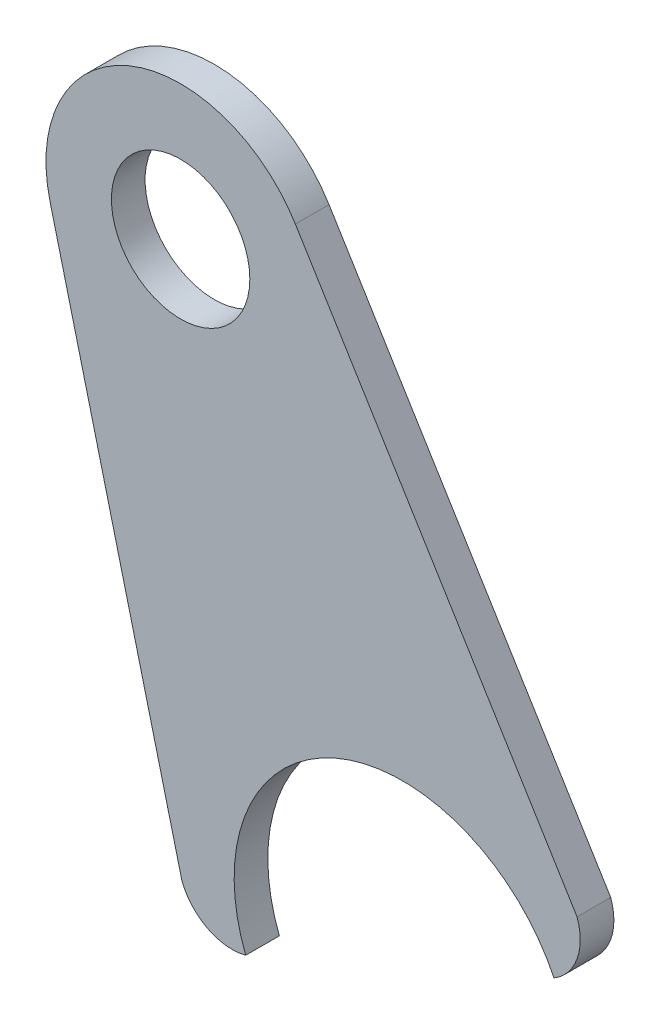
ISO-10303-21;
HEADER;
FILE_DESCRIPTION(('STEP AP214'),'2;1');
FILE_NAME('part.step','',(''),(''),'','','');
FILE_SCHEMA(('AUTOMOTIVE_DESIGN { 1 0 10303 214 1 1 1 1 }'));
ENDSEC;
DATA;
#1=APPLICATION_CONTEXT('core data for automotive mechanical design processes');
#2=APPLICATION_PROTOCOL_DEFINITION('international standard','automotive_design',2000,#1);
#3=PRODUCT_CONTEXT('',#1,'mechanical');
#4=PRODUCT('Part','Part','',(#3));
#5=PRODUCT_RELATED_PRODUCT_CATEGORY('part','',(#4));
#6=PRODUCT_DEFINITION_FORMATION('','',#4);
#7=PRODUCT_DEFINITION_CONTEXT('part definition',#1,'design');
#8=PRODUCT_DEFINITION('design','',#6,#7);
#9=PRODUCT_DEFINITION_SHAPE('','',#8);
#10=(LENGTH_UNIT() NAMED_UNIT(*) SI_UNIT(.MILLI.,.METRE.));
#11=(NAMED_UNIT(*) PLANE_ANGLE_UNIT() SI_UNIT($,.RADIAN.));
#12=(NAMED_UNIT(*) SI_UNIT($,.STERADIAN.) SOLID_ANGLE_UNIT());
#13=UNCERTAINTY_MEASURE_WITH_UNIT(LENGTH_MEASURE(1.E-05),#10,'distance_accuracy_value','');
#14=(GEOMETRIC_REPRESENTATION_CONTEXT(3) GLOBAL_UNCERTAINTY_ASSIGNED_CONTEXT((#13)) GLOBAL_UNIT_ASSIGNED_CONTEXT((#10,
#11,#12)) REPRESENTATION_CONTEXT('',''));
#15=CARTESIAN_POINT('',(0.,0.,0.));
#16=DIRECTION('',(0.,0.,1.));
#17=DIRECTION('',(1.,0.,0.));
#18=AXIS2_PLACEMENT_3D('',#15,#16,#17);
#19=CARTESIAN_POINT('',(-8.03353331694817,-0.430582274047139,1.5875));
#20=DIRECTION('',(0.,0.,-1.));
#21=DIRECTION('',(-1.,0.,0.));
#22=AXIS2_PLACEMENT_3D('',#19,#20,#21);
#23=PLANE('',#22);
#24=CARTESIAN_POINT('',(-8.03353331694817,-0.430582274047139,1.5875));
#25=DIRECTION('',(0.,0.,1.));
#26=DIRECTION('',(-1.,0.,0.));
#27=AXIS2_PLACEMENT_3D('',#24,#25,#26);
#28=CIRCLE('',#27,2.54);
#29=CARTESIAN_POINT('',(-10.3992230568477,-1.35530496465981,1.5875));
#30=VERTEX_POINT('',#29);
#31=CARTESIAN_POINT('',(-7.39325012638225,-2.88855652856624,1.5875));
#32=VERTEX_POINT('',#31);
#33=EDGE_CURVE('E143',#30,#32,#28,.T.);
#34=ORIENTED_EDGE('',*,*,#33,.T.);
#35=CARTESIAN_POINT('',(0.,0.,1.5875));
#36=DIRECTION('',(0.,0.,-1.));
#37=DIRECTION('',(1.,0.,0.));
#38=AXIS2_PLACEMENT_3D('',#35,#36,#37);
#39=CIRCLE('',#38,7.93749999999835);
#40=CARTESIAN_POINT('',(7.14682100900328,3.45352800991148,1.5875));
#41=VERTEX_POINT('',#40);
#42=EDGE_CURVE('E101',#32,#41,#39,.T.);
#43=ORIENTED_EDGE('',*,*,#42,.T.);
#44=CARTESIAN_POINT('',(5.84365736743861,5.6337492196294,1.5875));
#45=DIRECTION('',(0.,0.,1.));
#46=DIRECTION('',(1.,0.,0.));
#47=AXIS2_PLACEMENT_3D('',#44,#45,#46);
#48=CIRCLE('',#47,2.54);
#49=CARTESIAN_POINT('',(8.23265822447538,6.49646290624713,1.5875));
#50=VERTEX_POINT('',#49);
#51=EDGE_CURVE('E114',#41,#50,#48,.T.);
#52=ORIENTED_EDGE('',*,*,#51,.T.);
#53=DIRECTION('',(-0.522923544969686,0.852379590391709,0.));
#54=VECTOR('',#53,1.);
#55=CARTESIAN_POINT('',(8.23265822447538,6.49646290624713,1.5875));
#56=LINE('',#55,#54);
#57=CARTESIAN_POINT('',(-5.04959981775463,28.1469045021965,1.5875));
#58=VERTEX_POINT('',#57);
#59=EDGE_CURVE('E108',#50,#58,#56,.T.);
#60=ORIENTED_EDGE('',*,*,#59,.T.);
#61=CARTESIAN_POINT('',(-10.462210216742,24.826339991639,1.5875));
#62=DIRECTION('',(0.,0.,1.));
#63=DIRECTION('',(-1.,0.,0.));
#64=AXIS2_PLACEMENT_3D('',#61,#62,#63);
#65=CIRCLE('',#64,6.35);
#66=CARTESIAN_POINT('',(-16.6188921382303,23.2714227212934,1.5875));
#67=VERTEX_POINT('',#66);
#68=EDGE_CURVE('E112',#58,#67,#65,.T.);
#69=ORIENTED_EDGE('',*,*,#68,.T.);
#70=DIRECTION('',(0.244868861471754,-0.969556208108394,0.));
#71=VECTOR('',#70,1.);
#72=CARTESIAN_POINT('',(-10.3992230568477,-1.35530496465981,1.5875));
#73=LINE('',#72,#71);
#74=EDGE_CURVE('E64',#67,#30,#73,.T.);
#75=ORIENTED_EDGE('',*,*,#74,.T.);
#76=EDGE_LOOP('',(#34,#43,#52,#60,#69,#75));
#77=FACE_BOUND('',#76,.T.);
#78=CARTESIAN_POINT('',(-10.462210216742,24.826339991639,1.5875));
#79=DIRECTION('',(0.,0.,1.));
#80=DIRECTION('',(1.,0.,0.));
#81=AXIS2_PLACEMENT_3D('',#78,#79,#80);
#82=CIRCLE('',#81,3.26389999999782);
#83=CARTESIAN_POINT('',(-7.19831021674417,24.826339991639,1.5875));
#84=VERTEX_POINT('',#83);
#85=EDGE_CURVE('E136',#84,#84,#82,.T.);
#86=ORIENTED_EDGE('',*,*,#85,.F.);
#87=EDGE_LOOP('',(#86));
#88=FACE_BOUND('',#87,.T.);
#89=ADVANCED_FACE('F47',(#77,#88),#23,.F.);
#90=CARTESIAN_POINT('',(-8.03353331694817,-0.430582274047139,0.));
#91=DIRECTION('',(0.,0.,-1.));
#92=DIRECTION('',(-1.,0.,0.));
#93=AXIS2_PLACEMENT_3D('',#90,#91,#92);
#94=PLANE('',#93);
#95=CARTESIAN_POINT('',(-8.03353331694817,-0.430582274047139,0.));
#96=DIRECTION('',(0.,0.,1.));
#97=DIRECTION('',(-1.,0.,0.));
#98=AXIS2_PLACEMENT_3D('',#95,#96,#97);
#99=CIRCLE('',#98,2.54);
#100=CARTESIAN_POINT('',(-10.3992230568477,-1.35530496465981,0.));
#101=VERTEX_POINT('',#100);
#102=CARTESIAN_POINT('',(-7.39325012638225,-2.88855652856624,0.));
#103=VERTEX_POINT('',#102);
#104=EDGE_CURVE('E132',#101,#103,#99,.T.);
#105=ORIENTED_EDGE('',*,*,#104,.F.);
#106=DIRECTION('',(0.244868861471754,-0.969556208108394,0.));
#107=VECTOR('',#106,1.);
#108=CARTESIAN_POINT('',(-10.3992230568477,-1.35530496465981,0.));
#109=LINE('',#108,#107);
#110=CARTESIAN_POINT('',(-16.6188921382303,23.2714227212934,0.));
#111=VERTEX_POINT('',#110);
#112=EDGE_CURVE('E93',#111,#101,#109,.T.);
#113=ORIENTED_EDGE('',*,*,#112,.F.);
#114=CARTESIAN_POINT('',(-10.462210216742,24.826339991639,0.));
#115=DIRECTION('',(0.,0.,1.));
#116=DIRECTION('',(-1.,0.,0.));
#117=AXIS2_PLACEMENT_3D('',#114,#115,#116);
#118=CIRCLE('',#117,6.35);
#119=CARTESIAN_POINT('',(-5.04959981775463,28.1469045021965,0.));
#120=VERTEX_POINT('',#119);
#121=EDGE_CURVE('E87',#120,#111,#118,.T.);
#122=ORIENTED_EDGE('',*,*,#121,.F.);
#123=DIRECTION('',(-0.522923544969686,0.852379590391709,0.));
#124=VECTOR('',#123,1.);
#125=CARTESIAN_POINT('',(8.23265822447538,6.49646290624713,0.));
#126=LINE('',#125,#124);
#127=CARTESIAN_POINT('',(8.23265822447538,6.49646290624713,0.));
#128=VERTEX_POINT('',#127);
#129=EDGE_CURVE('E122',#128,#120,#126,.T.);
#130=ORIENTED_EDGE('',*,*,#129,.F.);
#131=CARTESIAN_POINT('',(5.84365736743861,5.6337492196294,0.));
#132=DIRECTION('',(0.,0.,1.));
#133=DIRECTION('',(1.,0.,0.));
#134=AXIS2_PLACEMENT_3D('',#131,#132,#133);
#135=CIRCLE('',#134,2.54);
#136=CARTESIAN_POINT('',(7.14682100900328,3.45352800991148,0.));
#137=VERTEX_POINT('',#136);
#138=EDGE_CURVE('E138',#137,#128,#135,.T.);
#139=ORIENTED_EDGE('',*,*,#138,.F.);
#140=CARTESIAN_POINT('',(0.,0.,0.));
#141=DIRECTION('',(0.,0.,-1.));
#142=DIRECTION('',(1.,0.,0.));
#143=AXIS2_PLACEMENT_3D('',#140,#141,#142);
#144=CIRCLE('',#143,7.93749999999835);
#145=EDGE_CURVE('E135',#103,#137,#144,.T.);
#146=ORIENTED_EDGE('',*,*,#145,.F.);
#147=EDGE_LOOP('',(#105,#113,#122,#130,#139,#146));
#148=FACE_BOUND('',#147,.T.);
#149=CARTESIAN_POINT('',(-10.462210216742,24.826339991639,0.));
#150=DIRECTION('',(0.,0.,1.));
#151=DIRECTION('',(1.,0.,0.));
#152=AXIS2_PLACEMENT_3D('',#149,#150,#151);
#153=CIRCLE('',#152,3.26389999999782);
#154=CARTESIAN_POINT('',(-7.19831021674417,24.826339991639,0.));
#155=VERTEX_POINT('',#154);
#156=EDGE_CURVE('E237',#155,#155,#153,.T.);
#157=ORIENTED_EDGE('',*,*,#156,.T.);
#158=EDGE_LOOP('',(#157));
#159=FACE_BOUND('',#158,.T.);
#160=ADVANCED_FACE('F152',(#148,#159),#94,.T.);
#161=CARTESIAN_POINT('',(-8.03353331694817,-0.430582274047139,1.5875));
#162=DIRECTION('',(0.,0.,-1.));
#163=DIRECTION('',(-1.,0.,0.));
#164=AXIS2_PLACEMENT_3D('',#161,#162,#163);
#165=CYLINDRICAL_SURFACE('',#164,2.54);
#166=ORIENTED_EDGE('',*,*,#104,.T.);
#167=DIRECTION('',(0.,0.,-1.));
#168=VECTOR('',#167,1.);
#169=CARTESIAN_POINT('',(-7.39325012638225,-2.88855652856624,1.5875));
#170=LINE('',#169,#168);
#171=EDGE_CURVE('E11',#32,#103,#170,.T.);
#172=ORIENTED_EDGE('',*,*,#171,.F.);
#173=ORIENTED_EDGE('',*,*,#33,.F.);
#174=DIRECTION('',(0.,0.,-1.));
#175=VECTOR('',#174,1.);
#176=CARTESIAN_POINT('',(-10.3992230568477,-1.35530496465981,1.5875));
#177=LINE('',#176,#175);
#178=EDGE_CURVE('E128',#30,#101,#177,.T.);
#179=ORIENTED_EDGE('',*,*,#178,.T.);
#180=EDGE_LOOP('',(#166,#172,#173,#179));
#181=FACE_BOUND('',#180,.T.);
#182=ADVANCED_FACE('F49',(#181),#165,.T.);
#183=CARTESIAN_POINT('',(0.,0.,1.5875));
#184=DIRECTION('',(0.,0.,-1.));
#185=DIRECTION('',(-1.,0.,0.));
#186=AXIS2_PLACEMENT_3D('',#183,#184,#185);
#187=CYLINDRICAL_SURFACE('',#186,7.93749999999835);
#188=ORIENTED_EDGE('',*,*,#145,.T.);
#189=DIRECTION('',(0.,0.,-1.));
#190=VECTOR('',#189,1.);
#191=CARTESIAN_POINT('',(7.14682100900328,3.45352800991148,1.5875));
#192=LINE('',#191,#190);
#193=EDGE_CURVE('E56',#41,#137,#192,.T.);
#194=ORIENTED_EDGE('',*,*,#193,.F.);
#195=ORIENTED_EDGE('',*,*,#42,.F.);
#196=ORIENTED_EDGE('',*,*,#171,.T.);
#197=EDGE_LOOP('',(#188,#194,#195,#196));
#198=FACE_BOUND('',#197,.T.);
#199=ADVANCED_FACE('F178',(#198),#187,.F.);
#200=CARTESIAN_POINT('',(5.84365736743861,5.6337492196294,1.5875));
#201=DIRECTION('',(0.,0.,-1.));
#202=DIRECTION('',(-1.,0.,0.));
#203=AXIS2_PLACEMENT_3D('',#200,#201,#202);
#204=CYLINDRICAL_SURFACE('',#203,2.54);
#205=ORIENTED_EDGE('',*,*,#138,.T.);
#206=DIRECTION('',(0.,0.,-1.));
#207=VECTOR('',#206,1.);
#208=CARTESIAN_POINT('',(8.23265822447538,6.49646290624713,1.5875));
#209=LINE('',#208,#207);
#210=EDGE_CURVE('E123',#50,#128,#209,.T.);
#211=ORIENTED_EDGE('',*,*,#210,.F.);
#212=ORIENTED_EDGE('',*,*,#51,.F.);
#213=ORIENTED_EDGE('',*,*,#193,.T.);
#214=EDGE_LOOP('',(#205,#211,#212,#213));
#215=FACE_BOUND('',#214,.T.);
#216=ADVANCED_FACE('F149',(#215),#204,.T.);
#217=CARTESIAN_POINT('',(8.23265822447538,6.49646290624713,1.5875));
#218=DIRECTION('',(-0.852379590391709,-0.522923544969686,0.));
#219=DIRECTION('',(0.522923544969686,-0.852379590391709,0.));
#220=AXIS2_PLACEMENT_3D('',#217,#218,#219);
#221=PLANE('',#220);
#222=ORIENTED_EDGE('',*,*,#129,.T.);
#223=DIRECTION('',(0.,0.,-1.));
#224=VECTOR('',#223,1.);
#225=CARTESIAN_POINT('',(-5.04959981775463,28.1469045021965,1.5875));
#226=LINE('',#225,#224);
#227=EDGE_CURVE('E119',#58,#120,#226,.T.);
#228=ORIENTED_EDGE('',*,*,#227,.F.);
#229=ORIENTED_EDGE('',*,*,#59,.F.);
#230=ORIENTED_EDGE('',*,*,#210,.T.);
#231=EDGE_LOOP('',(#222,#228,#229,#230));
#232=FACE_BOUND('',#231,.T.);
#233=ADVANCED_FACE('F120',(#232),#221,.F.);
#234=CARTESIAN_POINT('',(-10.462210216742,24.826339991639,1.5875));
#235=DIRECTION('',(0.,0.,-1.));
#236=DIRECTION('',(-1.,0.,0.));
#237=AXIS2_PLACEMENT_3D('',#234,#235,#236);
#238=CYLINDRICAL_SURFACE('',#237,6.35);
#239=ORIENTED_EDGE('',*,*,#121,.T.);
#240=DIRECTION('',(0.,0.,-1.));
#241=VECTOR('',#240,1.);
#242=CARTESIAN_POINT('',(-16.6188921382303,23.2714227212934,1.5875));
#243=LINE('',#242,#241);
#244=EDGE_CURVE('E124',#67,#111,#243,.T.);
#245=ORIENTED_EDGE('',*,*,#244,.F.);
#246=ORIENTED_EDGE('',*,*,#68,.F.);
#247=ORIENTED_EDGE('',*,*,#227,.T.);
#248=EDGE_LOOP('',(#239,#245,#246,#247));
#249=FACE_BOUND('',#248,.T.);
#250=ADVANCED_FACE('F126',(#249),#238,.T.);
#251=CARTESIAN_POINT('',(-10.3992230568477,-1.35530496465981,1.5875));
#252=DIRECTION('',(0.969556208108394,0.244868861471754,0.));
#253=DIRECTION('',(-0.244868861471754,0.969556208108394,0.));
#254=AXIS2_PLACEMENT_3D('',#251,#252,#253);
#255=PLANE('',#254);
#256=ORIENTED_EDGE('',*,*,#112,.T.);
#257=ORIENTED_EDGE('',*,*,#178,.F.);
#258=ORIENTED_EDGE('',*,*,#74,.F.);
#259=ORIENTED_EDGE('',*,*,#244,.T.);
#260=EDGE_LOOP('',(#256,#257,#258,#259));
#261=FACE_BOUND('',#260,.T.);
#262=ADVANCED_FACE('F157',(#261),#255,.F.);
#263=CARTESIAN_POINT('',(-10.462210216742,24.826339991639,1.5875));
#264=DIRECTION('',(0.,0.,-1.));
#265=DIRECTION('',(-1.,0.,0.));
#266=AXIS2_PLACEMENT_3D('',#263,#264,#265);
#267=CYLINDRICAL_SURFACE('',#266,3.26389999999782);
#268=ORIENTED_EDGE('',*,*,#85,.T.);
#269=EDGE_LOOP('',(#268));
#270=FACE_BOUND('',#269,.T.);
#271=ORIENTED_EDGE('',*,*,#156,.F.);
#272=EDGE_LOOP('',(#271));
#273=FACE_BOUND('',#272,.T.);
#274=ADVANCED_FACE('F159',(#270,#273),#267,.F.);
#275=CLOSED_SHELL('',(#89,#160,#182,#199,#216,#233,#250,#262,#274));
#276=MANIFOLD_SOLID_BREP('B2',#275);
#277=ADVANCED_BREP_SHAPE_REPRESENTATION('',(#18,#276),#14);
#278=SHAPE_DEFINITION_REPRESENTATION(#9,#277);
ENDSEC;
END-ISO-10303-21;
